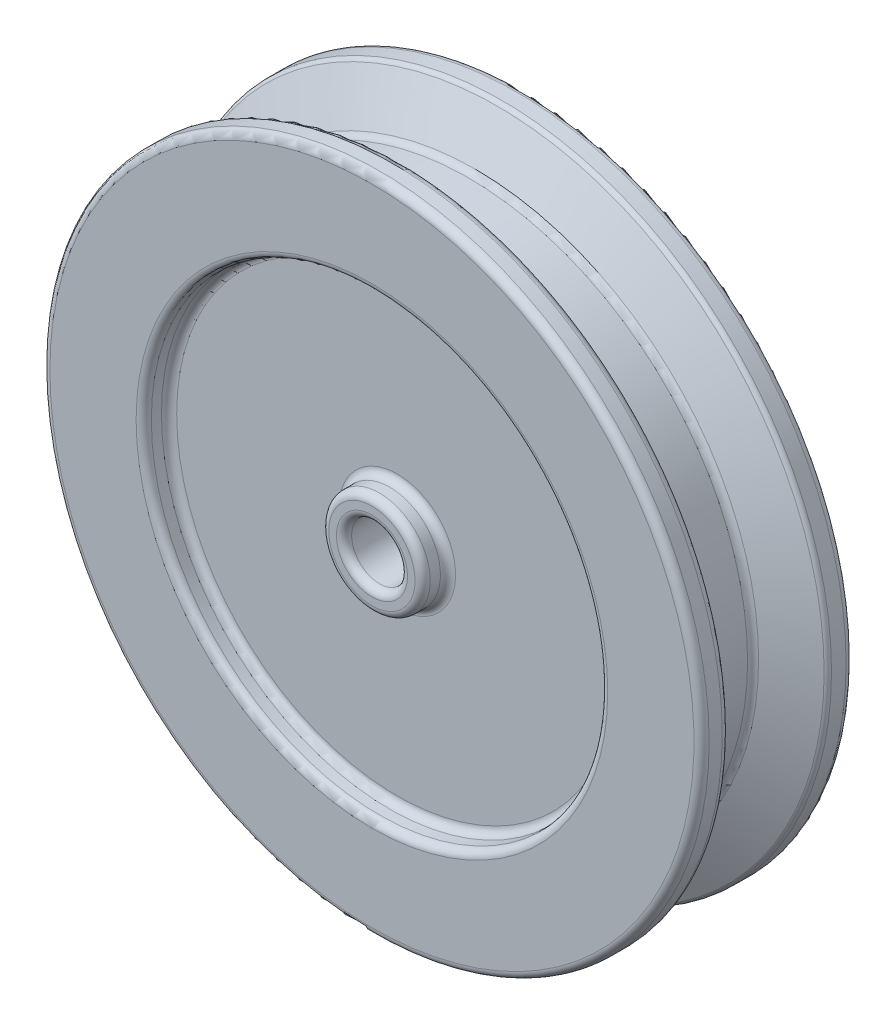
ISO-10303-21;
HEADER;
FILE_DESCRIPTION(('STEP AP214'),'2;1');
FILE_NAME('part.step','',(''),(''),'','','');
FILE_SCHEMA(('AUTOMOTIVE_DESIGN { 1 0 10303 214 1 1 1 1 }'));
ENDSEC;
DATA;
#1=APPLICATION_CONTEXT('core data for automotive mechanical design processes');
#2=APPLICATION_PROTOCOL_DEFINITION('international standard','automotive_design',2000,#1);
#3=PRODUCT_CONTEXT('',#1,'mechanical');
#4=PRODUCT('Part','Part','',(#3));
#5=PRODUCT_RELATED_PRODUCT_CATEGORY('part','',(#4));
#6=PRODUCT_DEFINITION_FORMATION('','',#4);
#7=PRODUCT_DEFINITION_CONTEXT('part definition',#1,'design');
#8=PRODUCT_DEFINITION('design','',#6,#7);
#9=PRODUCT_DEFINITION_SHAPE('','',#8);
#10=(LENGTH_UNIT() NAMED_UNIT(*) SI_UNIT(.MILLI.,.METRE.));
#11=(NAMED_UNIT(*) PLANE_ANGLE_UNIT() SI_UNIT($,.RADIAN.));
#12=(NAMED_UNIT(*) SI_UNIT($,.STERADIAN.) SOLID_ANGLE_UNIT());
#13=UNCERTAINTY_MEASURE_WITH_UNIT(LENGTH_MEASURE(1.E-05),#10,'distance_accuracy_value','');
#14=(GEOMETRIC_REPRESENTATION_CONTEXT(3) GLOBAL_UNCERTAINTY_ASSIGNED_CONTEXT((#13)) GLOBAL_UNIT_ASSIGNED_CONTEXT((#10,
#11,#12)) REPRESENTATION_CONTEXT('',''));
#15=CARTESIAN_POINT('',(0.,0.,0.));
#16=DIRECTION('',(0.,0.,1.));
#17=DIRECTION('',(1.,0.,0.));
#18=AXIS2_PLACEMENT_3D('',#15,#16,#17);
#19=CARTESIAN_POINT('',(0.,0.,0.));
#20=DIRECTION('',(0.,0.,1.));
#21=DIRECTION('',(1.,0.,0.));
#22=AXIS2_PLACEMENT_3D('',#19,#20,#21);
#23=CYLINDRICAL_SURFACE('',#22,2.794);
#24=CARTESIAN_POINT('',(0.,0.,-6.858));
#25=DIRECTION('',(0.,0.,1.));
#26=DIRECTION('',(1.,0.,0.));
#27=AXIS2_PLACEMENT_3D('',#24,#25,#26);
#28=CIRCLE('',#27,2.794);
#29=CARTESIAN_POINT('',(2.794,0.,-6.858));
#30=VERTEX_POINT('',#29);
#31=EDGE_CURVE('E133',#30,#30,#28,.F.);
#32=ORIENTED_EDGE('',*,*,#31,.T.);
#33=EDGE_LOOP('',(#32));
#34=FACE_BOUND('',#33,.T.);
#35=CARTESIAN_POINT('',(0.,0.,6.858));
#36=DIRECTION('',(0.,0.,-1.));
#37=DIRECTION('',(-1.,0.,0.));
#38=AXIS2_PLACEMENT_3D('',#35,#36,#37);
#39=CIRCLE('',#38,2.794);
#40=CARTESIAN_POINT('',(-2.794,0.,6.858));
#41=VERTEX_POINT('',#40);
#42=EDGE_CURVE('E137',#41,#41,#39,.F.);
#43=ORIENTED_EDGE('',*,*,#42,.T.);
#44=EDGE_LOOP('',(#43));
#45=FACE_BOUND('',#44,.T.);
#46=ADVANCED_FACE('F41',(#34,#45),#23,.F.);
#47=CARTESIAN_POINT('',(0.,2.794,-7.62));
#48=DIRECTION('',(0.,0.,1.));
#49=DIRECTION('',(1.,0.,0.));
#50=AXIS2_PLACEMENT_3D('',#47,#48,#49);
#51=PLANE('',#50);
#52=CARTESIAN_POINT('',(0.,0.,-7.62));
#53=DIRECTION('',(0.,0.,1.));
#54=DIRECTION('',(1.,0.,0.));
#55=AXIS2_PLACEMENT_3D('',#52,#53,#54);
#56=CIRCLE('',#55,3.556);
#57=CARTESIAN_POINT('',(3.556,0.,-7.62));
#58=VERTEX_POINT('',#57);
#59=EDGE_CURVE('E141',#58,#58,#56,.T.);
#60=ORIENTED_EDGE('',*,*,#59,.T.);
#61=EDGE_LOOP('',(#60));
#62=FACE_BOUND('',#61,.T.);
#63=CARTESIAN_POINT('',(0.,0.,-7.62));
#64=DIRECTION('',(0.,0.,1.));
#65=DIRECTION('',(1.,0.,0.));
#66=AXIS2_PLACEMENT_3D('',#63,#64,#65);
#67=CIRCLE('',#66,4.318);
#68=CARTESIAN_POINT('',(4.318,0.,-7.62));
#69=VERTEX_POINT('',#68);
#70=EDGE_CURVE('E145',#69,#69,#67,.F.);
#71=ORIENTED_EDGE('',*,*,#70,.T.);
#72=EDGE_LOOP('',(#71));
#73=FACE_BOUND('',#72,.T.);
#74=ADVANCED_FACE('F203',(#62,#73),#51,.F.);
#75=CARTESIAN_POINT('',(0.,0.,0.));
#76=DIRECTION('',(0.,0.,1.));
#77=DIRECTION('',(1.,0.,0.));
#78=AXIS2_PLACEMENT_3D('',#75,#76,#77);
#79=CYLINDRICAL_SURFACE('',#78,5.08);
#80=CARTESIAN_POINT('',(0.,0.,-5.842));
#81=DIRECTION('',(0.,0.,1.));
#82=DIRECTION('',(1.,0.,0.));
#83=AXIS2_PLACEMENT_3D('',#80,#81,#82);
#84=CIRCLE('',#83,5.08);
#85=CARTESIAN_POINT('',(5.08,0.,-5.842));
#86=VERTEX_POINT('',#85);
#87=EDGE_CURVE('E149',#86,#86,#84,.F.);
#88=ORIENTED_EDGE('',*,*,#87,.T.);
#89=EDGE_LOOP('',(#88));
#90=FACE_BOUND('',#89,.T.);
#91=CARTESIAN_POINT('',(0.,0.,-6.858));
#92=DIRECTION('',(0.,0.,1.));
#93=DIRECTION('',(1.,0.,0.));
#94=AXIS2_PLACEMENT_3D('',#91,#92,#93);
#95=CIRCLE('',#94,5.08);
#96=CARTESIAN_POINT('',(5.08,0.,-6.858));
#97=VERTEX_POINT('',#96);
#98=EDGE_CURVE('E153',#97,#97,#95,.T.);
#99=ORIENTED_EDGE('',*,*,#98,.T.);
#100=EDGE_LOOP('',(#99));
#101=FACE_BOUND('',#100,.T.);
#102=ADVANCED_FACE('F209',(#90,#101),#79,.T.);
#103=CARTESIAN_POINT('',(0.,5.08,-5.08));
#104=DIRECTION('',(0.,0.,1.));
#105=DIRECTION('',(1.,0.,0.));
#106=AXIS2_PLACEMENT_3D('',#103,#104,#105);
#107=PLANE('',#106);
#108=CARTESIAN_POINT('',(0.,0.,-5.08));
#109=DIRECTION('',(0.,0.,1.));
#110=DIRECTION('',(1.,0.,0.));
#111=AXIS2_PLACEMENT_3D('',#108,#109,#110);
#112=CIRCLE('',#111,5.842);
#113=CARTESIAN_POINT('',(5.842,0.,-5.08));
#114=VERTEX_POINT('',#113);
#115=EDGE_CURVE('E157',#114,#114,#112,.T.);
#116=ORIENTED_EDGE('',*,*,#115,.T.);
#117=EDGE_LOOP('',(#116));
#118=FACE_BOUND('',#117,.T.);
#119=CARTESIAN_POINT('',(0.,0.,-5.08));
#120=DIRECTION('',(0.,0.,1.));
#121=DIRECTION('',(1.,0.,0.));
#122=AXIS2_PLACEMENT_3D('',#119,#120,#121);
#123=CIRCLE('',#122,22.098);
#124=CARTESIAN_POINT('',(22.098,0.,-5.08));
#125=VERTEX_POINT('',#124);
#126=EDGE_CURVE('E161',#125,#125,#123,.F.);
#127=ORIENTED_EDGE('',*,*,#126,.T.);
#128=EDGE_LOOP('',(#127));
#129=FACE_BOUND('',#128,.T.);
#130=ADVANCED_FACE('F320',(#118,#129),#107,.F.);
#131=CARTESIAN_POINT('',(0.,0.,0.));
#132=DIRECTION('',(0.,0.,1.));
#133=DIRECTION('',(1.,0.,0.));
#134=AXIS2_PLACEMENT_3D('',#131,#132,#133);
#135=CYLINDRICAL_SURFACE('',#134,22.86);
#136=CARTESIAN_POINT('',(0.,0.,-5.842));
#137=DIRECTION('',(0.,0.,1.));
#138=DIRECTION('',(1.,0.,0.));
#139=AXIS2_PLACEMENT_3D('',#136,#137,#138);
#140=CIRCLE('',#139,22.86);
#141=CARTESIAN_POINT('',(22.86,0.,-5.842));
#142=VERTEX_POINT('',#141);
#143=EDGE_CURVE('E125',#142,#142,#140,.T.);
#144=ORIENTED_EDGE('',*,*,#143,.T.);
#145=EDGE_LOOP('',(#144));
#146=FACE_BOUND('',#145,.T.);
#147=CARTESIAN_POINT('',(0.,0.,-6.858));
#148=DIRECTION('',(0.,0.,1.));
#149=DIRECTION('',(1.,0.,0.));
#150=AXIS2_PLACEMENT_3D('',#147,#148,#149);
#151=CIRCLE('',#150,22.86);
#152=CARTESIAN_POINT('',(22.86,0.,-6.858));
#153=VERTEX_POINT('',#152);
#154=EDGE_CURVE('E129',#153,#153,#151,.F.);
#155=ORIENTED_EDGE('',*,*,#154,.T.);
#156=EDGE_LOOP('',(#155));
#157=FACE_BOUND('',#156,.T.);
#158=ADVANCED_FACE('F312',(#146,#157),#135,.F.);
#159=CARTESIAN_POINT('',(0.,22.86,-7.62));
#160=DIRECTION('',(0.,0.,1.));
#161=DIRECTION('',(1.,0.,0.));
#162=AXIS2_PLACEMENT_3D('',#159,#160,#161);
#163=PLANE('',#162);
#164=CARTESIAN_POINT('',(0.,0.,-7.62));
#165=DIRECTION('',(0.,0.,1.));
#166=DIRECTION('',(1.,0.,0.));
#167=AXIS2_PLACEMENT_3D('',#164,#165,#166);
#168=CIRCLE('',#167,23.622);
#169=CARTESIAN_POINT('',(23.622,0.,-7.62));
#170=VERTEX_POINT('',#169);
#171=EDGE_CURVE('E117',#170,#170,#168,.T.);
#172=ORIENTED_EDGE('',*,*,#171,.T.);
#173=EDGE_LOOP('',(#172));
#174=FACE_BOUND('',#173,.T.);
#175=CARTESIAN_POINT('',(0.,0.,-7.62));
#176=DIRECTION('',(0.,0.,1.));
#177=DIRECTION('',(1.,0.,0.));
#178=AXIS2_PLACEMENT_3D('',#175,#176,#177);
#179=CIRCLE('',#178,32.258);
#180=CARTESIAN_POINT('',(32.258,0.,-7.62));
#181=VERTEX_POINT('',#180);
#182=EDGE_CURVE('E121',#181,#181,#179,.F.);
#183=ORIENTED_EDGE('',*,*,#182,.T.);
#184=EDGE_LOOP('',(#183));
#185=FACE_BOUND('',#184,.T.);
#186=ADVANCED_FACE('F302',(#174,#185),#163,.F.);
#187=CARTESIAN_POINT('',(0.,0.,0.));
#188=DIRECTION('',(0.,0.,1.));
#189=DIRECTION('',(1.,0.,0.));
#190=AXIS2_PLACEMENT_3D('',#187,#188,#189);
#191=CYLINDRICAL_SURFACE('',#190,33.02);
#192=CARTESIAN_POINT('',(0.,0.,-5.39396126628495));
#193=DIRECTION('',(0.,0.,-1.));
#194=DIRECTION('',(-1.,0.,0.));
#195=AXIS2_PLACEMENT_3D('',#192,#193,#194);
#196=CIRCLE('',#195,33.02);
#197=CARTESIAN_POINT('',(-33.02,0.,-5.39396126628495));
#198=VERTEX_POINT('',#197);
#199=EDGE_CURVE('E10',#198,#198,#196,.T.);
#200=ORIENTED_EDGE('',*,*,#199,.T.);
#201=EDGE_LOOP('',(#200));
#202=FACE_BOUND('',#201,.T.);
#203=CARTESIAN_POINT('',(0.,0.,-6.858));
#204=DIRECTION('',(0.,0.,1.));
#205=DIRECTION('',(1.,0.,0.));
#206=AXIS2_PLACEMENT_3D('',#203,#204,#205);
#207=CIRCLE('',#206,33.02);
#208=CARTESIAN_POINT('',(33.02,0.,-6.858));
#209=VERTEX_POINT('',#208);
#210=EDGE_CURVE('E113',#209,#209,#207,.T.);
#211=ORIENTED_EDGE('',*,*,#210,.T.);
#212=EDGE_LOOP('',(#211));
#213=FACE_BOUND('',#212,.T.);
#214=ADVANCED_FACE('F292',(#202,#213),#191,.T.);
#215=CARTESIAN_POINT('',(0.,0.,-5.08));
#216=DIRECTION('',(0.,0.,-1.));
#217=DIRECTION('',(-1.,0.,0.));
#218=AXIS2_PLACEMENT_3D('',#215,#216,#217);
#219=CONICAL_SURFACE('',#218,33.02,1.10714871779409);
#220=CARTESIAN_POINT('',(0.,0.,-4.93959225325699));
#221=DIRECTION('',(0.,0.,1.));
#222=DIRECTION('',(1.,0.,0.));
#223=AXIS2_PLACEMENT_3D('',#220,#221,#222);
#224=CIRCLE('',#223,32.739184506514);
#225=CARTESIAN_POINT('',(32.739184506514,0.,-4.93959225325699));
#226=VERTEX_POINT('',#225);
#227=EDGE_CURVE('E49',#226,#226,#224,.T.);
#228=ORIENTED_EDGE('',*,*,#227,.T.);
#229=EDGE_LOOP('',(#228));
#230=FACE_BOUND('',#229,.T.);
#231=CARTESIAN_POINT('',(0.,0.,-2.75061162011451));
#232=DIRECTION('',(0.,0.,-1.));
#233=DIRECTION('',(-1.,0.,0.));
#234=AXIS2_PLACEMENT_3D('',#231,#232,#233);
#235=CIRCLE('',#234,28.361223240229);
#236=CARTESIAN_POINT('',(-28.361223240229,0.,-2.75061162011451));
#237=VERTEX_POINT('',#236);
#238=EDGE_CURVE('E165',#237,#237,#235,.T.);
#239=ORIENTED_EDGE('',*,*,#238,.T.);
#240=EDGE_LOOP('',(#239));
#241=FACE_BOUND('',#240,.T.);
#242=ADVANCED_FACE('F288',(#230,#241),#219,.T.);
#243=CARTESIAN_POINT('',(0.,0.,0.));
#244=DIRECTION('',(0.,0.,1.));
#245=DIRECTION('',(1.,0.,0.));
#246=AXIS2_PLACEMENT_3D('',#243,#244,#245);
#247=CYLINDRICAL_SURFACE('',#246,27.94);
#248=CARTESIAN_POINT('',(0.,0.,-2.06905810057258));
#249=DIRECTION('',(0.,0.,1.));
#250=DIRECTION('',(1.,0.,0.));
#251=AXIS2_PLACEMENT_3D('',#248,#249,#250);
#252=CIRCLE('',#251,27.94);
#253=CARTESIAN_POINT('',(27.94,0.,-2.06905810057258));
#254=VERTEX_POINT('',#253);
#255=EDGE_CURVE('E169',#254,#254,#252,.T.);
#256=ORIENTED_EDGE('',*,*,#255,.T.);
#257=EDGE_LOOP('',(#256));
#258=FACE_BOUND('',#257,.T.);
#259=CARTESIAN_POINT('',(0.,0.,2.06905810057258));
#260=DIRECTION('',(0.,0.,1.));
#261=DIRECTION('',(1.,0.,0.));
#262=AXIS2_PLACEMENT_3D('',#259,#260,#261);
#263=CIRCLE('',#262,27.94);
#264=CARTESIAN_POINT('',(27.94,0.,2.06905810057258));
#265=VERTEX_POINT('',#264);
#266=EDGE_CURVE('E173',#265,#265,#263,.F.);
#267=ORIENTED_EDGE('',*,*,#266,.T.);
#268=EDGE_LOOP('',(#267));
#269=FACE_BOUND('',#268,.T.);
#270=ADVANCED_FACE('F178',(#258,#269),#247,.T.);
#271=CARTESIAN_POINT('',(0.,2.794,7.62));
#272=DIRECTION('',(0.,0.,-1.));
#273=DIRECTION('',(1.,0.,0.));
#274=AXIS2_PLACEMENT_3D('',#271,#272,#273);
#275=PLANE('',#274);
#276=CARTESIAN_POINT('',(0.,0.,7.62));
#277=DIRECTION('',(0.,0.,-1.));
#278=DIRECTION('',(-1.,0.,0.));
#279=AXIS2_PLACEMENT_3D('',#276,#277,#278);
#280=CIRCLE('',#279,3.556);
#281=CARTESIAN_POINT('',(-3.556,0.,7.62));
#282=VERTEX_POINT('',#281);
#283=EDGE_CURVE('E105',#282,#282,#280,.T.);
#284=ORIENTED_EDGE('',*,*,#283,.T.);
#285=EDGE_LOOP('',(#284));
#286=FACE_BOUND('',#285,.T.);
#287=CARTESIAN_POINT('',(0.,0.,7.62));
#288=DIRECTION('',(0.,0.,-1.));
#289=DIRECTION('',(-1.,0.,0.));
#290=AXIS2_PLACEMENT_3D('',#287,#288,#289);
#291=CIRCLE('',#290,4.318);
#292=CARTESIAN_POINT('',(-4.318,0.,7.62));
#293=VERTEX_POINT('',#292);
#294=EDGE_CURVE('E109',#293,#293,#291,.F.);
#295=ORIENTED_EDGE('',*,*,#294,.T.);
#296=EDGE_LOOP('',(#295));
#297=FACE_BOUND('',#296,.T.);
#298=ADVANCED_FACE('F356',(#286,#297),#275,.F.);
#299=CARTESIAN_POINT('',(0.,0.,0.));
#300=DIRECTION('',(0.,0.,-1.));
#301=DIRECTION('',(1.,0.,0.));
#302=AXIS2_PLACEMENT_3D('',#299,#300,#301);
#303=CYLINDRICAL_SURFACE('',#302,5.08);
#304=CARTESIAN_POINT('',(0.,0.,5.842));
#305=DIRECTION('',(0.,0.,-1.));
#306=DIRECTION('',(-1.,0.,0.));
#307=AXIS2_PLACEMENT_3D('',#304,#305,#306);
#308=CIRCLE('',#307,5.08);
#309=CARTESIAN_POINT('',(-5.08,0.,5.842));
#310=VERTEX_POINT('',#309);
#311=EDGE_CURVE('E97',#310,#310,#308,.F.);
#312=ORIENTED_EDGE('',*,*,#311,.T.);
#313=EDGE_LOOP('',(#312));
#314=FACE_BOUND('',#313,.T.);
#315=CARTESIAN_POINT('',(0.,0.,6.858));
#316=DIRECTION('',(0.,0.,-1.));
#317=DIRECTION('',(-1.,0.,0.));
#318=AXIS2_PLACEMENT_3D('',#315,#316,#317);
#319=CIRCLE('',#318,5.08);
#320=CARTESIAN_POINT('',(-5.08,0.,6.858));
#321=VERTEX_POINT('',#320);
#322=EDGE_CURVE('E101',#321,#321,#319,.T.);
#323=ORIENTED_EDGE('',*,*,#322,.T.);
#324=EDGE_LOOP('',(#323));
#325=FACE_BOUND('',#324,.T.);
#326=ADVANCED_FACE('F365',(#314,#325),#303,.T.);
#327=CARTESIAN_POINT('',(0.,5.08,5.08));
#328=DIRECTION('',(0.,0.,-1.));
#329=DIRECTION('',(1.,0.,0.));
#330=AXIS2_PLACEMENT_3D('',#327,#328,#329);
#331=PLANE('',#330);
#332=CARTESIAN_POINT('',(0.,0.,5.08));
#333=DIRECTION('',(0.,0.,-1.));
#334=DIRECTION('',(-1.,0.,0.));
#335=AXIS2_PLACEMENT_3D('',#332,#333,#334);
#336=CIRCLE('',#335,5.842);
#337=CARTESIAN_POINT('',(-5.842,0.,5.08));
#338=VERTEX_POINT('',#337);
#339=EDGE_CURVE('E89',#338,#338,#336,.T.);
#340=ORIENTED_EDGE('',*,*,#339,.T.);
#341=EDGE_LOOP('',(#340));
#342=FACE_BOUND('',#341,.T.);
#343=CARTESIAN_POINT('',(0.,0.,5.08));
#344=DIRECTION('',(0.,0.,-1.));
#345=DIRECTION('',(-1.,0.,0.));
#346=AXIS2_PLACEMENT_3D('',#343,#344,#345);
#347=CIRCLE('',#346,22.098);
#348=CARTESIAN_POINT('',(-22.098,0.,5.08));
#349=VERTEX_POINT('',#348);
#350=EDGE_CURVE('E93',#349,#349,#347,.F.);
#351=ORIENTED_EDGE('',*,*,#350,.T.);
#352=EDGE_LOOP('',(#351));
#353=FACE_BOUND('',#352,.T.);
#354=ADVANCED_FACE('F374',(#342,#353),#331,.F.);
#355=CARTESIAN_POINT('',(0.,0.,0.));
#356=DIRECTION('',(0.,0.,-1.));
#357=DIRECTION('',(1.,0.,0.));
#358=AXIS2_PLACEMENT_3D('',#355,#356,#357);
#359=CYLINDRICAL_SURFACE('',#358,22.86);
#360=CARTESIAN_POINT('',(0.,0.,5.842));
#361=DIRECTION('',(0.,0.,-1.));
#362=DIRECTION('',(-1.,0.,0.));
#363=AXIS2_PLACEMENT_3D('',#360,#361,#362);
#364=CIRCLE('',#363,22.86);
#365=CARTESIAN_POINT('',(-22.86,0.,5.842));
#366=VERTEX_POINT('',#365);
#367=EDGE_CURVE('E81',#366,#366,#364,.T.);
#368=ORIENTED_EDGE('',*,*,#367,.T.);
#369=EDGE_LOOP('',(#368));
#370=FACE_BOUND('',#369,.T.);
#371=CARTESIAN_POINT('',(0.,0.,6.858));
#372=DIRECTION('',(0.,0.,-1.));
#373=DIRECTION('',(-1.,0.,0.));
#374=AXIS2_PLACEMENT_3D('',#371,#372,#373);
#375=CIRCLE('',#374,22.86);
#376=CARTESIAN_POINT('',(-22.86,0.,6.858));
#377=VERTEX_POINT('',#376);
#378=EDGE_CURVE('E85',#377,#377,#375,.F.);
#379=ORIENTED_EDGE('',*,*,#378,.T.);
#380=EDGE_LOOP('',(#379));
#381=FACE_BOUND('',#380,.T.);
#382=ADVANCED_FACE('F383',(#370,#381),#359,.F.);
#383=CARTESIAN_POINT('',(0.,22.86,7.62));
#384=DIRECTION('',(0.,0.,-1.));
#385=DIRECTION('',(1.,0.,0.));
#386=AXIS2_PLACEMENT_3D('',#383,#384,#385);
#387=PLANE('',#386);
#388=CARTESIAN_POINT('',(0.,0.,7.62));
#389=DIRECTION('',(0.,0.,-1.));
#390=DIRECTION('',(-1.,0.,0.));
#391=AXIS2_PLACEMENT_3D('',#388,#389,#390);
#392=CIRCLE('',#391,23.622);
#393=CARTESIAN_POINT('',(-23.622,0.,7.62));
#394=VERTEX_POINT('',#393);
#395=EDGE_CURVE('E73',#394,#394,#392,.T.);
#396=ORIENTED_EDGE('',*,*,#395,.T.);
#397=EDGE_LOOP('',(#396));
#398=FACE_BOUND('',#397,.T.);
#399=CARTESIAN_POINT('',(0.,0.,7.62));
#400=DIRECTION('',(0.,0.,-1.));
#401=DIRECTION('',(-1.,0.,0.));
#402=AXIS2_PLACEMENT_3D('',#399,#400,#401);
#403=CIRCLE('',#402,32.258);
#404=CARTESIAN_POINT('',(-32.258,0.,7.62));
#405=VERTEX_POINT('',#404);
#406=EDGE_CURVE('E77',#405,#405,#403,.F.);
#407=ORIENTED_EDGE('',*,*,#406,.T.);
#408=EDGE_LOOP('',(#407));
#409=FACE_BOUND('',#408,.T.);
#410=ADVANCED_FACE('F199',(#398,#409),#387,.F.);
#411=CARTESIAN_POINT('',(0.,0.,0.));
#412=DIRECTION('',(0.,0.,-1.));
#413=DIRECTION('',(1.,0.,0.));
#414=AXIS2_PLACEMENT_3D('',#411,#412,#413);
#415=CYLINDRICAL_SURFACE('',#414,33.02);
#416=CARTESIAN_POINT('',(0.,0.,6.858));
#417=DIRECTION('',(0.,0.,-1.));
#418=DIRECTION('',(-1.,0.,0.));
#419=AXIS2_PLACEMENT_3D('',#416,#417,#418);
#420=CIRCLE('',#419,33.02);
#421=CARTESIAN_POINT('',(-33.02,0.,6.858));
#422=VERTEX_POINT('',#421);
#423=EDGE_CURVE('E65',#422,#422,#420,.T.);
#424=ORIENTED_EDGE('',*,*,#423,.T.);
#425=EDGE_LOOP('',(#424));
#426=FACE_BOUND('',#425,.T.);
#427=CARTESIAN_POINT('',(0.,0.,5.55094189942742));
#428=DIRECTION('',(0.,0.,-1.));
#429=DIRECTION('',(-1.,0.,0.));
#430=AXIS2_PLACEMENT_3D('',#427,#428,#429);
#431=CIRCLE('',#430,33.02);
#432=CARTESIAN_POINT('',(-33.02,0.,5.55094189942742));
#433=VERTEX_POINT('',#432);
#434=EDGE_CURVE('E69',#433,#433,#431,.F.);
#435=ORIENTED_EDGE('',*,*,#434,.T.);
#436=EDGE_LOOP('',(#435));
#437=FACE_BOUND('',#436,.T.);
#438=ADVANCED_FACE('F189',(#426,#437),#415,.T.);
#439=CARTESIAN_POINT('',(0.,0.,5.08));
#440=DIRECTION('',(0.,0.,1.));
#441=DIRECTION('',(-1.,0.,0.));
#442=AXIS2_PLACEMENT_3D('',#439,#440,#441);
#443=CONICAL_SURFACE('',#442,33.02,1.10714871779409);
#444=CARTESIAN_POINT('',(0.,0.,4.86938837988549));
#445=DIRECTION('',(0.,0.,-1.));
#446=DIRECTION('',(-1.,0.,0.));
#447=AXIS2_PLACEMENT_3D('',#444,#445,#446);
#448=CIRCLE('',#447,32.598776759771);
#449=CARTESIAN_POINT('',(-32.598776759771,0.,4.86938837988549));
#450=VERTEX_POINT('',#449);
#451=EDGE_CURVE('E54',#450,#450,#448,.T.);
#452=ORIENTED_EDGE('',*,*,#451,.T.);
#453=EDGE_LOOP('',(#452));
#454=FACE_BOUND('',#453,.T.);
#455=CARTESIAN_POINT('',(0.,0.,2.75061162011451));
#456=DIRECTION('',(0.,0.,1.));
#457=DIRECTION('',(1.,0.,0.));
#458=AXIS2_PLACEMENT_3D('',#455,#456,#457);
#459=CIRCLE('',#458,28.361223240229);
#460=CARTESIAN_POINT('',(28.361223240229,0.,2.75061162011451));
#461=VERTEX_POINT('',#460);
#462=EDGE_CURVE('E59',#461,#461,#459,.T.);
#463=ORIENTED_EDGE('',*,*,#462,.T.);
#464=EDGE_LOOP('',(#463));
#465=FACE_BOUND('',#464,.T.);
#466=ADVANCED_FACE('F186',(#454,#465),#443,.T.);
#467=CARTESIAN_POINT('',(0.,0.,-2.06905810057258));
#468=DIRECTION('',(0.,0.,1.));
#469=DIRECTION('',(1.,0.,0.));
#470=AXIS2_PLACEMENT_3D('',#467,#468,#469);
#471=TOROIDAL_SURFACE('',#470,28.702,0.762);
#472=ORIENTED_EDGE('',*,*,#238,.F.);
#473=EDGE_LOOP('',(#472));
#474=FACE_BOUND('',#473,.T.);
#475=ORIENTED_EDGE('',*,*,#255,.F.);
#476=EDGE_LOOP('',(#475));
#477=FACE_BOUND('',#476,.T.);
#478=ADVANCED_FACE('F188',(#474,#477),#471,.F.);
#479=CARTESIAN_POINT('',(0.,0.,-5.842));
#480=DIRECTION('',(0.,0.,1.));
#481=DIRECTION('',(1.,0.,0.));
#482=AXIS2_PLACEMENT_3D('',#479,#480,#481);
#483=TOROIDAL_SURFACE('',#482,5.842,0.762);
#484=ORIENTED_EDGE('',*,*,#87,.F.);
#485=EDGE_LOOP('',(#484));
#486=FACE_BOUND('',#485,.T.);
#487=ORIENTED_EDGE('',*,*,#115,.F.);
#488=EDGE_LOOP('',(#487));
#489=FACE_BOUND('',#488,.T.);
#490=ADVANCED_FACE('F196',(#486,#489),#483,.F.);
#491=CARTESIAN_POINT('',(0.,0.,-6.858));
#492=DIRECTION('',(0.,0.,1.));
#493=DIRECTION('',(1.,0.,0.));
#494=AXIS2_PLACEMENT_3D('',#491,#492,#493);
#495=TOROIDAL_SURFACE('',#494,3.556,0.762);
#496=ORIENTED_EDGE('',*,*,#31,.F.);
#497=EDGE_LOOP('',(#496));
#498=FACE_BOUND('',#497,.T.);
#499=ORIENTED_EDGE('',*,*,#59,.F.);
#500=EDGE_LOOP('',(#499));
#501=FACE_BOUND('',#500,.T.);
#502=ADVANCED_FACE('F217',(#498,#501),#495,.T.);
#503=CARTESIAN_POINT('',(0.,0.,-6.858));
#504=DIRECTION('',(0.,0.,1.));
#505=DIRECTION('',(1.,0.,0.));
#506=AXIS2_PLACEMENT_3D('',#503,#504,#505);
#507=TOROIDAL_SURFACE('',#506,4.318,0.762);
#508=ORIENTED_EDGE('',*,*,#70,.F.);
#509=EDGE_LOOP('',(#508));
#510=FACE_BOUND('',#509,.T.);
#511=ORIENTED_EDGE('',*,*,#98,.F.);
#512=EDGE_LOOP('',(#511));
#513=FACE_BOUND('',#512,.T.);
#514=ADVANCED_FACE('F221',(#510,#513),#507,.T.);
#515=CARTESIAN_POINT('',(0.,0.,-5.842));
#516=DIRECTION('',(0.,0.,1.));
#517=DIRECTION('',(1.,0.,0.));
#518=AXIS2_PLACEMENT_3D('',#515,#516,#517);
#519=TOROIDAL_SURFACE('',#518,22.098,0.762);
#520=ORIENTED_EDGE('',*,*,#126,.F.);
#521=EDGE_LOOP('',(#520));
#522=FACE_BOUND('',#521,.T.);
#523=ORIENTED_EDGE('',*,*,#143,.F.);
#524=EDGE_LOOP('',(#523));
#525=FACE_BOUND('',#524,.T.);
#526=ADVANCED_FACE('F225',(#522,#525),#519,.F.);
#527=CARTESIAN_POINT('',(0.,0.,-6.858));
#528=DIRECTION('',(0.,0.,1.));
#529=DIRECTION('',(1.,0.,0.));
#530=AXIS2_PLACEMENT_3D('',#527,#528,#529);
#531=TOROIDAL_SURFACE('',#530,23.622,0.762);
#532=ORIENTED_EDGE('',*,*,#154,.F.);
#533=EDGE_LOOP('',(#532));
#534=FACE_BOUND('',#533,.T.);
#535=ORIENTED_EDGE('',*,*,#171,.F.);
#536=EDGE_LOOP('',(#535));
#537=FACE_BOUND('',#536,.T.);
#538=ADVANCED_FACE('F229',(#534,#537),#531,.T.);
#539=CARTESIAN_POINT('',(0.,0.,-6.858));
#540=DIRECTION('',(0.,0.,1.));
#541=DIRECTION('',(1.,0.,0.));
#542=AXIS2_PLACEMENT_3D('',#539,#540,#541);
#543=TOROIDAL_SURFACE('',#542,32.258,0.762);
#544=ORIENTED_EDGE('',*,*,#182,.F.);
#545=EDGE_LOOP('',(#544));
#546=FACE_BOUND('',#545,.T.);
#547=ORIENTED_EDGE('',*,*,#210,.F.);
#548=EDGE_LOOP('',(#547));
#549=FACE_BOUND('',#548,.T.);
#550=ADVANCED_FACE('F233',(#546,#549),#543,.T.);
#551=CARTESIAN_POINT('',(0.,0.,6.858));
#552=DIRECTION('',(0.,0.,-1.));
#553=DIRECTION('',(-1.,0.,0.));
#554=AXIS2_PLACEMENT_3D('',#551,#552,#553);
#555=TOROIDAL_SURFACE('',#554,3.556,0.762);
#556=ORIENTED_EDGE('',*,*,#283,.F.);
#557=EDGE_LOOP('',(#556));
#558=FACE_BOUND('',#557,.T.);
#559=ORIENTED_EDGE('',*,*,#42,.F.);
#560=EDGE_LOOP('',(#559));
#561=FACE_BOUND('',#560,.T.);
#562=ADVANCED_FACE('F237',(#558,#561),#555,.T.);
#563=CARTESIAN_POINT('',(0.,0.,5.842));
#564=DIRECTION('',(0.,0.,-1.));
#565=DIRECTION('',(-1.,0.,0.));
#566=AXIS2_PLACEMENT_3D('',#563,#564,#565);
#567=TOROIDAL_SURFACE('',#566,5.842,0.762);
#568=ORIENTED_EDGE('',*,*,#339,.F.);
#569=EDGE_LOOP('',(#568));
#570=FACE_BOUND('',#569,.T.);
#571=ORIENTED_EDGE('',*,*,#311,.F.);
#572=EDGE_LOOP('',(#571));
#573=FACE_BOUND('',#572,.T.);
#574=ADVANCED_FACE('F241',(#570,#573),#567,.F.);
#575=CARTESIAN_POINT('',(0.,0.,6.858));
#576=DIRECTION('',(0.,0.,-1.));
#577=DIRECTION('',(-1.,0.,0.));
#578=AXIS2_PLACEMENT_3D('',#575,#576,#577);
#579=TOROIDAL_SURFACE('',#578,4.318,0.762);
#580=ORIENTED_EDGE('',*,*,#322,.F.);
#581=EDGE_LOOP('',(#580));
#582=FACE_BOUND('',#581,.T.);
#583=ORIENTED_EDGE('',*,*,#294,.F.);
#584=EDGE_LOOP('',(#583));
#585=FACE_BOUND('',#584,.T.);
#586=ADVANCED_FACE('F245',(#582,#585),#579,.T.);
#587=CARTESIAN_POINT('',(0.,0.,5.842));
#588=DIRECTION('',(0.,0.,-1.));
#589=DIRECTION('',(-1.,0.,0.));
#590=AXIS2_PLACEMENT_3D('',#587,#588,#589);
#591=TOROIDAL_SURFACE('',#590,22.098,0.762);
#592=ORIENTED_EDGE('',*,*,#367,.F.);
#593=EDGE_LOOP('',(#592));
#594=FACE_BOUND('',#593,.T.);
#595=ORIENTED_EDGE('',*,*,#350,.F.);
#596=EDGE_LOOP('',(#595));
#597=FACE_BOUND('',#596,.T.);
#598=ADVANCED_FACE('F249',(#594,#597),#591,.F.);
#599=CARTESIAN_POINT('',(0.,0.,6.858));
#600=DIRECTION('',(0.,0.,-1.));
#601=DIRECTION('',(-1.,0.,0.));
#602=AXIS2_PLACEMENT_3D('',#599,#600,#601);
#603=TOROIDAL_SURFACE('',#602,23.622,0.762);
#604=ORIENTED_EDGE('',*,*,#395,.F.);
#605=EDGE_LOOP('',(#604));
#606=FACE_BOUND('',#605,.T.);
#607=ORIENTED_EDGE('',*,*,#378,.F.);
#608=EDGE_LOOP('',(#607));
#609=FACE_BOUND('',#608,.T.);
#610=ADVANCED_FACE('F253',(#606,#609),#603,.T.);
#611=CARTESIAN_POINT('',(0.,0.,6.858));
#612=DIRECTION('',(0.,0.,-1.));
#613=DIRECTION('',(-1.,0.,0.));
#614=AXIS2_PLACEMENT_3D('',#611,#612,#613);
#615=TOROIDAL_SURFACE('',#614,32.258,0.762);
#616=ORIENTED_EDGE('',*,*,#423,.F.);
#617=EDGE_LOOP('',(#616));
#618=FACE_BOUND('',#617,.T.);
#619=ORIENTED_EDGE('',*,*,#406,.F.);
#620=EDGE_LOOP('',(#619));
#621=FACE_BOUND('',#620,.T.);
#622=ADVANCED_FACE('F257',(#618,#621),#615,.T.);
#623=CARTESIAN_POINT('',(0.,0.,5.55094189942742));
#624=DIRECTION('',(0.,0.,-1.));
#625=DIRECTION('',(-1.,0.,0.));
#626=AXIS2_PLACEMENT_3D('',#623,#624,#625);
#627=TOROIDAL_SURFACE('',#626,32.258,0.762);
#628=ORIENTED_EDGE('',*,*,#451,.F.);
#629=EDGE_LOOP('',(#628));
#630=FACE_BOUND('',#629,.T.);
#631=ORIENTED_EDGE('',*,*,#434,.F.);
#632=EDGE_LOOP('',(#631));
#633=FACE_BOUND('',#632,.T.);
#634=ADVANCED_FACE('F183',(#630,#633),#627,.T.);
#635=CARTESIAN_POINT('',(0.,0.,2.06905810057258));
#636=DIRECTION('',(0.,0.,1.));
#637=DIRECTION('',(1.,0.,0.));
#638=AXIS2_PLACEMENT_3D('',#635,#636,#637);
#639=TOROIDAL_SURFACE('',#638,28.702,0.762);
#640=ORIENTED_EDGE('',*,*,#266,.F.);
#641=EDGE_LOOP('',(#640));
#642=FACE_BOUND('',#641,.T.);
#643=ORIENTED_EDGE('',*,*,#462,.F.);
#644=EDGE_LOOP('',(#643));
#645=FACE_BOUND('',#644,.T.);
#646=ADVANCED_FACE('F180',(#642,#645),#639,.F.);
#647=CARTESIAN_POINT('',(0.,0.,-5.39396126628495));
#648=DIRECTION('',(0.,0.,-1.));
#649=DIRECTION('',(-1.,0.,0.));
#650=AXIS2_PLACEMENT_3D('',#647,#648,#649);
#651=TOROIDAL_SURFACE('',#650,32.512,0.508);
#652=ORIENTED_EDGE('',*,*,#199,.F.);
#653=EDGE_LOOP('',(#652));
#654=FACE_BOUND('',#653,.T.);
#655=ORIENTED_EDGE('',*,*,#227,.F.);
#656=EDGE_LOOP('',(#655));
#657=FACE_BOUND('',#656,.T.);
#658=ADVANCED_FACE('F43',(#654,#657),#651,.T.);
#659=CLOSED_SHELL('',(#46,#74,#102,#130,#158,#186,#214,#242,#270,#298,#326,#354,#382,#410,#438,
#466,#478,#490,#502,#514,#526,#538,#550,#562,#574,#586,#598,#610,#622,#634,#646,#658));
#660=MANIFOLD_SOLID_BREP('B2',#659);
#661=ADVANCED_BREP_SHAPE_REPRESENTATION('',(#18,#660),#14);
#662=SHAPE_DEFINITION_REPRESENTATION(#9,#661);
ENDSEC;
END-ISO-10303-21;
